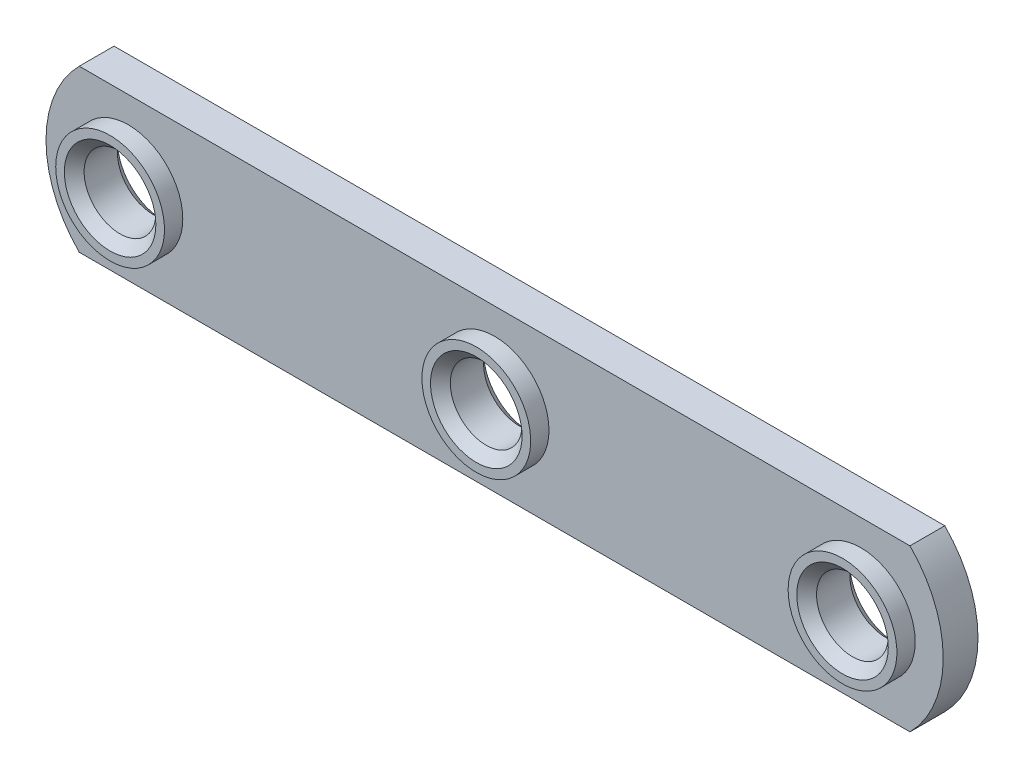
ISO-10303-21;
HEADER;
FILE_DESCRIPTION(('STEP AP214'),'2;1');
FILE_NAME('part.step','',(''),(''),'','','');
FILE_SCHEMA(('AUTOMOTIVE_DESIGN { 1 0 10303 214 1 1 1 1 }'));
ENDSEC;
DATA;
#1=APPLICATION_CONTEXT('core data for automotive mechanical design processes');
#2=APPLICATION_PROTOCOL_DEFINITION('international standard','automotive_design',2000,#1);
#3=PRODUCT_CONTEXT('',#1,'mechanical');
#4=PRODUCT('Part','Part','',(#3));
#5=PRODUCT_RELATED_PRODUCT_CATEGORY('part','',(#4));
#6=PRODUCT_DEFINITION_FORMATION('','',#4);
#7=PRODUCT_DEFINITION_CONTEXT('part definition',#1,'design');
#8=PRODUCT_DEFINITION('design','',#6,#7);
#9=PRODUCT_DEFINITION_SHAPE('','',#8);
#10=(LENGTH_UNIT() NAMED_UNIT(*) SI_UNIT(.MILLI.,.METRE.));
#11=(NAMED_UNIT(*) PLANE_ANGLE_UNIT() SI_UNIT($,.RADIAN.));
#12=(NAMED_UNIT(*) SI_UNIT($,.STERADIAN.) SOLID_ANGLE_UNIT());
#13=UNCERTAINTY_MEASURE_WITH_UNIT(LENGTH_MEASURE(1.E-05),#10,'distance_accuracy_value','');
#14=(GEOMETRIC_REPRESENTATION_CONTEXT(3) GLOBAL_UNCERTAINTY_ASSIGNED_CONTEXT((#13)) GLOBAL_UNIT_ASSIGNED_CONTEXT((#10,
#11,#12)) REPRESENTATION_CONTEXT('',''));
#15=CARTESIAN_POINT('',(0.,0.,0.));
#16=DIRECTION('',(0.,0.,1.));
#17=DIRECTION('',(1.,0.,0.));
#18=AXIS2_PLACEMENT_3D('',#15,#16,#17);
#19=CARTESIAN_POINT('',(48.5901999999992,0.,-1.2065));
#20=DIRECTION('',(0.,0.,1.));
#21=DIRECTION('',(1.,0.,0.));
#22=AXIS2_PLACEMENT_3D('',#19,#20,#21);
#23=CYLINDRICAL_SURFACE('',#22,7.92480000000076);
#24=CARTESIAN_POINT('',(48.5901999999992,0.,1.2065));
#25=DIRECTION('',(0.,0.,1.));
#26=DIRECTION('',(1.,0.,0.));
#27=AXIS2_PLACEMENT_3D('',#24,#25,#26);
#28=CIRCLE('',#27,7.92480000000076);
#29=CARTESIAN_POINT('',(54.209515887188,-5.588,1.2065));
#30=VERTEX_POINT('',#29);
#31=CARTESIAN_POINT('',(54.209515887188,5.588,1.2065));
#32=VERTEX_POINT('',#31);
#33=EDGE_CURVE('E102',#30,#32,#28,.T.);
#34=ORIENTED_EDGE('',*,*,#33,.F.);
#35=DIRECTION('',(0.,0.,1.));
#36=VECTOR('',#35,1.);
#37=CARTESIAN_POINT('',(54.209515887188,-5.588,-1.2065));
#38=LINE('',#37,#36);
#39=CARTESIAN_POINT('',(54.209515887188,-5.588,-1.2065));
#40=VERTEX_POINT('',#39);
#41=EDGE_CURVE('E50',#40,#30,#38,.T.);
#42=ORIENTED_EDGE('',*,*,#41,.F.);
#43=CARTESIAN_POINT('',(48.5901999999992,0.,-1.2065));
#44=DIRECTION('',(0.,0.,1.));
#45=DIRECTION('',(1.,0.,0.));
#46=AXIS2_PLACEMENT_3D('',#43,#44,#45);
#47=CIRCLE('',#46,7.92480000000076);
#48=CARTESIAN_POINT('',(54.209515887188,5.588,-1.2065));
#49=VERTEX_POINT('',#48);
#50=EDGE_CURVE('E95',#40,#49,#47,.T.);
#51=ORIENTED_EDGE('',*,*,#50,.T.);
#52=DIRECTION('',(0.,0.,1.));
#53=VECTOR('',#52,1.);
#54=CARTESIAN_POINT('',(54.209515887188,5.588,-1.2065));
#55=LINE('',#54,#53);
#56=EDGE_CURVE('E78',#49,#32,#55,.T.);
#57=ORIENTED_EDGE('',*,*,#56,.T.);
#58=EDGE_LOOP('',(#34,#42,#51,#57));
#59=FACE_BOUND('',#58,.T.);
#60=ADVANCED_FACE('F33',(#59),#23,.T.);
#61=CARTESIAN_POINT('',(-3.40951588718771,-5.588,-1.2065));
#62=DIRECTION('',(0.,-1.,0.));
#63=DIRECTION('',(1.,0.,0.));
#64=AXIS2_PLACEMENT_3D('',#61,#62,#63);
#65=PLANE('',#64);
#66=DIRECTION('',(1.,0.,0.));
#67=VECTOR('',#66,1.);
#68=CARTESIAN_POINT('',(-3.40951588718771,-5.588,1.2065));
#69=LINE('',#68,#67);
#70=CARTESIAN_POINT('',(-3.40951588718771,-5.588,1.2065));
#71=VERTEX_POINT('',#70);
#72=EDGE_CURVE('E97',#71,#30,#69,.T.);
#73=ORIENTED_EDGE('',*,*,#72,.F.);
#74=DIRECTION('',(0.,0.,1.));
#75=VECTOR('',#74,1.);
#76=CARTESIAN_POINT('',(-3.40951588718771,-5.588,-1.2065));
#77=LINE('',#76,#75);
#78=CARTESIAN_POINT('',(-3.40951588718771,-5.588,-1.2065));
#79=VERTEX_POINT('',#78);
#80=EDGE_CURVE('E67',#79,#71,#77,.T.);
#81=ORIENTED_EDGE('',*,*,#80,.F.);
#82=DIRECTION('',(1.,0.,0.));
#83=VECTOR('',#82,1.);
#84=CARTESIAN_POINT('',(-3.40951588718771,-5.588,-1.2065));
#85=LINE('',#84,#83);
#86=EDGE_CURVE('E92',#79,#40,#85,.T.);
#87=ORIENTED_EDGE('',*,*,#86,.T.);
#88=ORIENTED_EDGE('',*,*,#41,.T.);
#89=EDGE_LOOP('',(#73,#81,#87,#88));
#90=FACE_BOUND('',#89,.T.);
#91=ADVANCED_FACE('F159',(#90),#65,.T.);
#92=CARTESIAN_POINT('',(2.20980000000002,0.,-1.2065));
#93=DIRECTION('',(0.,0.,1.));
#94=DIRECTION('',(1.,0.,0.));
#95=AXIS2_PLACEMENT_3D('',#92,#93,#94);
#96=CYLINDRICAL_SURFACE('',#95,7.92480000000003);
#97=CARTESIAN_POINT('',(2.20980000000002,0.,1.2065));
#98=DIRECTION('',(0.,0.,1.));
#99=DIRECTION('',(1.,0.,0.));
#100=AXIS2_PLACEMENT_3D('',#97,#98,#99);
#101=CIRCLE('',#100,7.92480000000003);
#102=CARTESIAN_POINT('',(-3.40951588718771,5.588,1.2065));
#103=VERTEX_POINT('',#102);
#104=EDGE_CURVE('E86',#103,#71,#101,.T.);
#105=ORIENTED_EDGE('',*,*,#104,.F.);
#106=DIRECTION('',(0.,0.,1.));
#107=VECTOR('',#106,1.);
#108=CARTESIAN_POINT('',(-3.40951588718771,5.588,-1.2065));
#109=LINE('',#108,#107);
#110=CARTESIAN_POINT('',(-3.40951588718771,5.588,-1.2065));
#111=VERTEX_POINT('',#110);
#112=EDGE_CURVE('E81',#111,#103,#109,.T.);
#113=ORIENTED_EDGE('',*,*,#112,.F.);
#114=CARTESIAN_POINT('',(2.20980000000002,0.,-1.2065));
#115=DIRECTION('',(0.,0.,1.));
#116=DIRECTION('',(1.,0.,0.));
#117=AXIS2_PLACEMENT_3D('',#114,#115,#116);
#118=CIRCLE('',#117,7.92480000000003);
#119=EDGE_CURVE('E84',#111,#79,#118,.T.);
#120=ORIENTED_EDGE('',*,*,#119,.T.);
#121=ORIENTED_EDGE('',*,*,#80,.T.);
#122=EDGE_LOOP('',(#105,#113,#120,#121));
#123=FACE_BOUND('',#122,.T.);
#124=ADVANCED_FACE('F83',(#123),#96,.T.);
#125=CARTESIAN_POINT('',(54.209515887188,5.588,-1.2065));
#126=DIRECTION('',(0.,1.,0.));
#127=DIRECTION('',(0.,0.,1.));
#128=AXIS2_PLACEMENT_3D('',#125,#126,#127);
#129=PLANE('',#128);
#130=DIRECTION('',(-1.,0.,0.));
#131=VECTOR('',#130,1.);
#132=CARTESIAN_POINT('',(54.209515887188,5.588,1.2065));
#133=LINE('',#132,#131);
#134=EDGE_CURVE('E105',#32,#103,#133,.T.);
#135=ORIENTED_EDGE('',*,*,#134,.F.);
#136=ORIENTED_EDGE('',*,*,#56,.F.);
#137=DIRECTION('',(-1.,0.,0.));
#138=VECTOR('',#137,1.);
#139=CARTESIAN_POINT('',(54.209515887188,5.588,-1.2065));
#140=LINE('',#139,#138);
#141=EDGE_CURVE('E91',#49,#111,#140,.T.);
#142=ORIENTED_EDGE('',*,*,#141,.T.);
#143=ORIENTED_EDGE('',*,*,#112,.T.);
#144=EDGE_LOOP('',(#135,#136,#142,#143));
#145=FACE_BOUND('',#144,.T.);
#146=ADVANCED_FACE('F94',(#145),#129,.T.);
#147=CARTESIAN_POINT('',(48.5901999999992,0.,-1.2065));
#148=DIRECTION('',(0.,0.,1.));
#149=DIRECTION('',(1.,0.,0.));
#150=AXIS2_PLACEMENT_3D('',#147,#148,#149);
#151=PLANE('',#150);
#152=CARTESIAN_POINT('',(0.,0.,-1.2065));
#153=DIRECTION('',(0.,0.,1.));
#154=DIRECTION('',(1.,0.,0.));
#155=AXIS2_PLACEMENT_3D('',#152,#153,#154);
#156=CIRCLE('',#155,3.17499999999998);
#157=CARTESIAN_POINT('',(3.17499999999998,0.,-1.2065));
#158=VERTEX_POINT('',#157);
#159=EDGE_CURVE('E129',#158,#158,#156,.T.);
#160=ORIENTED_EDGE('',*,*,#159,.T.);
#161=EDGE_LOOP('',(#160));
#162=FACE_BOUND('',#161,.T.);
#163=CARTESIAN_POINT('',(50.8,0.,-1.2065));
#164=DIRECTION('',(0.,0.,1.));
#165=DIRECTION('',(1.,0.,0.));
#166=AXIS2_PLACEMENT_3D('',#163,#164,#165);
#167=CIRCLE('',#166,3.17499999999999);
#168=CARTESIAN_POINT('',(53.975,0.,-1.2065));
#169=VERTEX_POINT('',#168);
#170=EDGE_CURVE('E126',#169,#169,#167,.T.);
#171=ORIENTED_EDGE('',*,*,#170,.T.);
#172=EDGE_LOOP('',(#171));
#173=FACE_BOUND('',#172,.T.);
#174=CARTESIAN_POINT('',(25.4,0.,-1.2065));
#175=DIRECTION('',(0.,0.,1.));
#176=DIRECTION('',(1.,0.,0.));
#177=AXIS2_PLACEMENT_3D('',#174,#175,#176);
#178=CIRCLE('',#177,3.175);
#179=CARTESIAN_POINT('',(28.575,0.,-1.2065));
#180=VERTEX_POINT('',#179);
#181=EDGE_CURVE('E123',#180,#180,#178,.T.);
#182=ORIENTED_EDGE('',*,*,#181,.T.);
#183=EDGE_LOOP('',(#182));
#184=FACE_BOUND('',#183,.T.);
#185=ORIENTED_EDGE('',*,*,#50,.F.);
#186=ORIENTED_EDGE('',*,*,#86,.F.);
#187=ORIENTED_EDGE('',*,*,#119,.F.);
#188=ORIENTED_EDGE('',*,*,#141,.F.);
#189=EDGE_LOOP('',(#185,#186,#187,#188));
#190=FACE_BOUND('',#189,.T.);
#191=ADVANCED_FACE('F90',(#162,#173,#184,#190),#151,.F.);
#192=CARTESIAN_POINT('',(48.5901999999992,0.,1.2065));
#193=DIRECTION('',(0.,0.,1.));
#194=DIRECTION('',(1.,0.,0.));
#195=AXIS2_PLACEMENT_3D('',#192,#193,#194);
#196=PLANE('',#195);
#197=CARTESIAN_POINT('',(50.8,0.,1.2065));
#198=DIRECTION('',(0.,0.,1.));
#199=DIRECTION('',(1.,0.,0.));
#200=AXIS2_PLACEMENT_3D('',#197,#198,#199);
#201=CIRCLE('',#200,3.7719);
#202=CARTESIAN_POINT('',(54.5719,0.,1.2065));
#203=VERTEX_POINT('',#202);
#204=EDGE_CURVE('E120',#203,#203,#201,.T.);
#205=ORIENTED_EDGE('',*,*,#204,.F.);
#206=EDGE_LOOP('',(#205));
#207=FACE_BOUND('',#206,.T.);
#208=CARTESIAN_POINT('',(0.,0.,1.2065));
#209=DIRECTION('',(0.,0.,1.));
#210=DIRECTION('',(1.,0.,0.));
#211=AXIS2_PLACEMENT_3D('',#208,#209,#210);
#212=CIRCLE('',#211,3.7719);
#213=CARTESIAN_POINT('',(3.7719,0.,1.2065));
#214=VERTEX_POINT('',#213);
#215=EDGE_CURVE('E117',#214,#214,#212,.T.);
#216=ORIENTED_EDGE('',*,*,#215,.F.);
#217=EDGE_LOOP('',(#216));
#218=FACE_BOUND('',#217,.T.);
#219=CARTESIAN_POINT('',(25.4,0.,1.2065));
#220=DIRECTION('',(0.,0.,1.));
#221=DIRECTION('',(1.,0.,0.));
#222=AXIS2_PLACEMENT_3D('',#219,#220,#221);
#223=CIRCLE('',#222,3.7719);
#224=CARTESIAN_POINT('',(29.1719,0.,1.2065));
#225=VERTEX_POINT('',#224);
#226=EDGE_CURVE('E112',#225,#225,#223,.T.);
#227=ORIENTED_EDGE('',*,*,#226,.F.);
#228=EDGE_LOOP('',(#227));
#229=FACE_BOUND('',#228,.T.);
#230=ORIENTED_EDGE('',*,*,#33,.T.);
#231=ORIENTED_EDGE('',*,*,#134,.T.);
#232=ORIENTED_EDGE('',*,*,#104,.T.);
#233=ORIENTED_EDGE('',*,*,#72,.T.);
#234=EDGE_LOOP('',(#230,#231,#232,#233));
#235=FACE_BOUND('',#234,.T.);
#236=ADVANCED_FACE('F148',(#207,#218,#229,#235),#196,.T.);
#237=CARTESIAN_POINT('',(25.4,0.,2.4765));
#238=DIRECTION('',(0.,0.,-1.));
#239=DIRECTION('',(-1.,0.,0.));
#240=AXIS2_PLACEMENT_3D('',#237,#238,#239);
#241=CYLINDRICAL_SURFACE('',#240,3.7719);
#242=CARTESIAN_POINT('',(25.4,0.,2.4765));
#243=DIRECTION('',(0.,0.,-1.));
#244=DIRECTION('',(-1.,0.,0.));
#245=AXIS2_PLACEMENT_3D('',#242,#243,#244);
#246=CIRCLE('',#245,3.7719);
#247=CARTESIAN_POINT('',(21.6281,0.,2.4765));
#248=VERTEX_POINT('',#247);
#249=EDGE_CURVE('E106',#248,#248,#246,.T.);
#250=ORIENTED_EDGE('',*,*,#249,.T.);
#251=EDGE_LOOP('',(#250));
#252=FACE_BOUND('',#251,.T.);
#253=ORIENTED_EDGE('',*,*,#226,.T.);
#254=EDGE_LOOP('',(#253));
#255=FACE_BOUND('',#254,.T.);
#256=ADVANCED_FACE('F213',(#252,#255),#241,.T.);
#257=CARTESIAN_POINT('',(29.1719,0.,2.4765));
#258=DIRECTION('',(0.,0.,1.));
#259=DIRECTION('',(1.,0.,0.));
#260=AXIS2_PLACEMENT_3D('',#257,#258,#259);
#261=PLANE('',#260);
#262=CARTESIAN_POINT('',(25.4,0.,2.4765));
#263=DIRECTION('',(0.,0.,1.));
#264=DIRECTION('',(1.,0.,0.));
#265=AXIS2_PLACEMENT_3D('',#262,#263,#264);
#266=CIRCLE('',#265,3.175);
#267=CARTESIAN_POINT('',(28.575,0.,2.4765));
#268=VERTEX_POINT('',#267);
#269=EDGE_CURVE('E188',#268,#268,#266,.T.);
#270=ORIENTED_EDGE('',*,*,#269,.F.);
#271=EDGE_LOOP('',(#270));
#272=FACE_BOUND('',#271,.T.);
#273=ORIENTED_EDGE('',*,*,#249,.F.);
#274=EDGE_LOOP('',(#273));
#275=FACE_BOUND('',#274,.T.);
#276=ADVANCED_FACE('F216',(#272,#275),#261,.T.);
#277=CARTESIAN_POINT('',(0.,0.,2.4765));
#278=DIRECTION('',(0.,0.,-1.));
#279=DIRECTION('',(-1.,0.,0.));
#280=AXIS2_PLACEMENT_3D('',#277,#278,#279);
#281=CYLINDRICAL_SURFACE('',#280,3.7719);
#282=CARTESIAN_POINT('',(0.,0.,2.4765));
#283=DIRECTION('',(0.,0.,-1.));
#284=DIRECTION('',(-1.,0.,0.));
#285=AXIS2_PLACEMENT_3D('',#282,#283,#284);
#286=CIRCLE('',#285,3.7719);
#287=CARTESIAN_POINT('',(-3.7719,0.,2.4765));
#288=VERTEX_POINT('',#287);
#289=EDGE_CURVE('E208',#288,#288,#286,.T.);
#290=ORIENTED_EDGE('',*,*,#289,.T.);
#291=EDGE_LOOP('',(#290));
#292=FACE_BOUND('',#291,.T.);
#293=ORIENTED_EDGE('',*,*,#215,.T.);
#294=EDGE_LOOP('',(#293));
#295=FACE_BOUND('',#294,.T.);
#296=ADVANCED_FACE('F218',(#292,#295),#281,.T.);
#297=CARTESIAN_POINT('',(3.7719,0.,2.4765));
#298=DIRECTION('',(0.,0.,1.));
#299=DIRECTION('',(1.,0.,0.));
#300=AXIS2_PLACEMENT_3D('',#297,#298,#299);
#301=PLANE('',#300);
#302=CARTESIAN_POINT('',(0.,0.,2.4765));
#303=DIRECTION('',(0.,0.,1.));
#304=DIRECTION('',(1.,0.,0.));
#305=AXIS2_PLACEMENT_3D('',#302,#303,#304);
#306=CIRCLE('',#305,3.175);
#307=CARTESIAN_POINT('',(3.175,0.,2.4765));
#308=VERTEX_POINT('',#307);
#309=EDGE_CURVE('E189',#308,#308,#306,.T.);
#310=ORIENTED_EDGE('',*,*,#309,.F.);
#311=EDGE_LOOP('',(#310));
#312=FACE_BOUND('',#311,.T.);
#313=ORIENTED_EDGE('',*,*,#289,.F.);
#314=EDGE_LOOP('',(#313));
#315=FACE_BOUND('',#314,.T.);
#316=ADVANCED_FACE('F225',(#312,#315),#301,.T.);
#317=CARTESIAN_POINT('',(50.8,0.,2.4765));
#318=DIRECTION('',(0.,0.,-1.));
#319=DIRECTION('',(-1.,0.,0.));
#320=AXIS2_PLACEMENT_3D('',#317,#318,#319);
#321=CYLINDRICAL_SURFACE('',#320,3.7719);
#322=CARTESIAN_POINT('',(50.8,0.,2.4765));
#323=DIRECTION('',(0.,0.,-1.));
#324=DIRECTION('',(-1.,0.,0.));
#325=AXIS2_PLACEMENT_3D('',#322,#323,#324);
#326=CIRCLE('',#325,3.7719);
#327=CARTESIAN_POINT('',(47.0281,0.,2.4765));
#328=VERTEX_POINT('',#327);
#329=EDGE_CURVE('E205',#328,#328,#326,.T.);
#330=ORIENTED_EDGE('',*,*,#329,.T.);
#331=EDGE_LOOP('',(#330));
#332=FACE_BOUND('',#331,.T.);
#333=ORIENTED_EDGE('',*,*,#204,.T.);
#334=EDGE_LOOP('',(#333));
#335=FACE_BOUND('',#334,.T.);
#336=ADVANCED_FACE('F271',(#332,#335),#321,.T.);
#337=CARTESIAN_POINT('',(54.5719,0.,2.4765));
#338=DIRECTION('',(0.,0.,1.));
#339=DIRECTION('',(1.,0.,0.));
#340=AXIS2_PLACEMENT_3D('',#337,#338,#339);
#341=PLANE('',#340);
#342=CARTESIAN_POINT('',(50.8,0.,2.4765));
#343=DIRECTION('',(0.,0.,1.));
#344=DIRECTION('',(1.,0.,0.));
#345=AXIS2_PLACEMENT_3D('',#342,#343,#344);
#346=CIRCLE('',#345,3.175);
#347=CARTESIAN_POINT('',(53.975,0.,2.4765));
#348=VERTEX_POINT('',#347);
#349=EDGE_CURVE('E199',#348,#348,#346,.T.);
#350=ORIENTED_EDGE('',*,*,#349,.F.);
#351=EDGE_LOOP('',(#350));
#352=FACE_BOUND('',#351,.T.);
#353=ORIENTED_EDGE('',*,*,#329,.F.);
#354=EDGE_LOOP('',(#353));
#355=FACE_BOUND('',#354,.T.);
#356=ADVANCED_FACE('F277',(#352,#355),#341,.T.);
#357=CARTESIAN_POINT('',(50.8,0.,2.4765));
#358=DIRECTION('',(0.,0.,1.));
#359=DIRECTION('',(1.,0.,0.));
#360=AXIS2_PLACEMENT_3D('',#357,#358,#359);
#361=CYLINDRICAL_SURFACE('',#360,2.48793000000001);
#362=CARTESIAN_POINT('',(50.8,0.,-0.519430000000017));
#363=DIRECTION('',(0.,0.,1.));
#364=DIRECTION('',(1.,0.,0.));
#365=AXIS2_PLACEMENT_3D('',#362,#363,#364);
#366=CIRCLE('',#365,2.48793000000001);
#367=CARTESIAN_POINT('',(53.28793,0.,-0.519430000000017));
#368=VERTEX_POINT('',#367);
#369=EDGE_CURVE('E42',#368,#368,#366,.F.);
#370=ORIENTED_EDGE('',*,*,#369,.T.);
#371=EDGE_LOOP('',(#370));
#372=FACE_BOUND('',#371,.T.);
#373=CARTESIAN_POINT('',(50.8,0.,1.78943000000003));
#374=DIRECTION('',(0.,0.,1.));
#375=DIRECTION('',(1.,0.,0.));
#376=AXIS2_PLACEMENT_3D('',#373,#374,#375);
#377=CIRCLE('',#376,2.48793000000001);
#378=CARTESIAN_POINT('',(53.28793,0.,1.78943000000003));
#379=VERTEX_POINT('',#378);
#380=EDGE_CURVE('E202',#379,#379,#377,.T.);
#381=ORIENTED_EDGE('',*,*,#380,.T.);
#382=EDGE_LOOP('',(#381));
#383=FACE_BOUND('',#382,.T.);
#384=ADVANCED_FACE('F137',(#372,#383),#361,.F.);
#385=CARTESIAN_POINT('',(50.8,0.,2.4765));
#386=DIRECTION('',(0.,0.,1.));
#387=DIRECTION('',(1.,0.,0.));
#388=AXIS2_PLACEMENT_3D('',#385,#386,#387);
#389=CONICAL_SURFACE('',#388,3.175,0.785398163397457);
#390=ORIENTED_EDGE('',*,*,#380,.F.);
#391=EDGE_LOOP('',(#390));
#392=FACE_BOUND('',#391,.T.);
#393=ORIENTED_EDGE('',*,*,#349,.T.);
#394=EDGE_LOOP('',(#393));
#395=FACE_BOUND('',#394,.T.);
#396=ADVANCED_FACE('F291',(#392,#395),#389,.F.);
#397=CARTESIAN_POINT('',(25.4,0.,2.4765));
#398=DIRECTION('',(0.,0.,1.));
#399=DIRECTION('',(1.,0.,0.));
#400=AXIS2_PLACEMENT_3D('',#397,#398,#399);
#401=CYLINDRICAL_SURFACE('',#400,2.48793000000001);
#402=CARTESIAN_POINT('',(25.4,0.,-0.51943));
#403=DIRECTION('',(0.,0.,1.));
#404=DIRECTION('',(1.,0.,0.));
#405=AXIS2_PLACEMENT_3D('',#402,#403,#404);
#406=CIRCLE('',#405,2.48793000000001);
#407=CARTESIAN_POINT('',(27.88793,0.,-0.51943));
#408=VERTEX_POINT('',#407);
#409=EDGE_CURVE('E11',#408,#408,#406,.F.);
#410=ORIENTED_EDGE('',*,*,#409,.T.);
#411=EDGE_LOOP('',(#410));
#412=FACE_BOUND('',#411,.T.);
#413=CARTESIAN_POINT('',(25.4,0.,1.78943000000003));
#414=DIRECTION('',(0.,0.,1.));
#415=DIRECTION('',(1.,0.,0.));
#416=AXIS2_PLACEMENT_3D('',#413,#414,#415);
#417=CIRCLE('',#416,2.48793000000001);
#418=CARTESIAN_POINT('',(27.88793,0.,1.78943000000003));
#419=VERTEX_POINT('',#418);
#420=EDGE_CURVE('E192',#419,#419,#417,.T.);
#421=ORIENTED_EDGE('',*,*,#420,.T.);
#422=EDGE_LOOP('',(#421));
#423=FACE_BOUND('',#422,.T.);
#424=ADVANCED_FACE('F298',(#412,#423),#401,.F.);
#425=CARTESIAN_POINT('',(25.4,0.,2.4765));
#426=DIRECTION('',(0.,0.,1.));
#427=DIRECTION('',(1.,0.,0.));
#428=AXIS2_PLACEMENT_3D('',#425,#426,#427);
#429=CONICAL_SURFACE('',#428,3.175,0.78539816339746);
#430=ORIENTED_EDGE('',*,*,#420,.F.);
#431=EDGE_LOOP('',(#430));
#432=FACE_BOUND('',#431,.T.);
#433=ORIENTED_EDGE('',*,*,#269,.T.);
#434=EDGE_LOOP('',(#433));
#435=FACE_BOUND('',#434,.T.);
#436=ADVANCED_FACE('F183',(#432,#435),#429,.F.);
#437=CARTESIAN_POINT('',(0.,0.,2.4765));
#438=DIRECTION('',(0.,0.,1.));
#439=DIRECTION('',(1.,0.,0.));
#440=AXIS2_PLACEMENT_3D('',#437,#438,#439);
#441=CYLINDRICAL_SURFACE('',#440,2.48793000000001);
#442=CARTESIAN_POINT('',(0.,0.,-0.51943000000002));
#443=DIRECTION('',(0.,0.,1.));
#444=DIRECTION('',(1.,0.,0.));
#445=AXIS2_PLACEMENT_3D('',#442,#443,#444);
#446=CIRCLE('',#445,2.48793000000001);
#447=CARTESIAN_POINT('',(2.48793000000001,0.,-0.51943000000002));
#448=VERTEX_POINT('',#447);
#449=EDGE_CURVE('E132',#448,#448,#446,.F.);
#450=ORIENTED_EDGE('',*,*,#449,.T.);
#451=EDGE_LOOP('',(#450));
#452=FACE_BOUND('',#451,.T.);
#453=CARTESIAN_POINT('',(0.,0.,1.78943000000003));
#454=DIRECTION('',(0.,0.,1.));
#455=DIRECTION('',(1.,0.,0.));
#456=AXIS2_PLACEMENT_3D('',#453,#454,#455);
#457=CIRCLE('',#456,2.48793000000001);
#458=CARTESIAN_POINT('',(2.48793000000001,0.,1.78943000000003));
#459=VERTEX_POINT('',#458);
#460=EDGE_CURVE('E187',#459,#459,#457,.T.);
#461=ORIENTED_EDGE('',*,*,#460,.T.);
#462=EDGE_LOOP('',(#461));
#463=FACE_BOUND('',#462,.T.);
#464=ADVANCED_FACE('F174',(#452,#463),#441,.F.);
#465=CARTESIAN_POINT('',(0.,0.,2.4765));
#466=DIRECTION('',(0.,0.,1.));
#467=DIRECTION('',(1.,0.,0.));
#468=AXIS2_PLACEMENT_3D('',#465,#466,#467);
#469=CONICAL_SURFACE('',#468,3.175,0.785398163397461);
#470=ORIENTED_EDGE('',*,*,#460,.F.);
#471=EDGE_LOOP('',(#470));
#472=FACE_BOUND('',#471,.T.);
#473=ORIENTED_EDGE('',*,*,#309,.T.);
#474=EDGE_LOOP('',(#473));
#475=FACE_BOUND('',#474,.T.);
#476=ADVANCED_FACE('F169',(#472,#475),#469,.F.);
#477=CARTESIAN_POINT('',(0.,0.,-1.2065));
#478=DIRECTION('',(0.,0.,-1.));
#479=DIRECTION('',(-1.,0.,0.));
#480=AXIS2_PLACEMENT_3D('',#477,#478,#479);
#481=CONICAL_SURFACE('',#480,3.17499999999998,0.785398163397447);
#482=ORIENTED_EDGE('',*,*,#449,.F.);
#483=EDGE_LOOP('',(#482));
#484=FACE_BOUND('',#483,.T.);
#485=ORIENTED_EDGE('',*,*,#159,.F.);
#486=EDGE_LOOP('',(#485));
#487=FACE_BOUND('',#486,.T.);
#488=ADVANCED_FACE('F143',(#484,#487),#481,.F.);
#489=CARTESIAN_POINT('',(50.8,0.,-1.2065));
#490=DIRECTION('',(0.,0.,-1.));
#491=DIRECTION('',(-1.,0.,0.));
#492=AXIS2_PLACEMENT_3D('',#489,#490,#491);
#493=CONICAL_SURFACE('',#492,3.17499999999999,0.785398163397449);
#494=ORIENTED_EDGE('',*,*,#369,.F.);
#495=EDGE_LOOP('',(#494));
#496=FACE_BOUND('',#495,.T.);
#497=ORIENTED_EDGE('',*,*,#170,.F.);
#498=EDGE_LOOP('',(#497));
#499=FACE_BOUND('',#498,.T.);
#500=ADVANCED_FACE('F140',(#496,#499),#493,.F.);
#501=CARTESIAN_POINT('',(25.4,0.,-1.2065));
#502=DIRECTION('',(0.,0.,-1.));
#503=DIRECTION('',(-1.,0.,0.));
#504=AXIS2_PLACEMENT_3D('',#501,#502,#503);
#505=CONICAL_SURFACE('',#504,3.175,0.785398163397442);
#506=ORIENTED_EDGE('',*,*,#409,.F.);
#507=EDGE_LOOP('',(#506));
#508=FACE_BOUND('',#507,.T.);
#509=ORIENTED_EDGE('',*,*,#181,.F.);
#510=EDGE_LOOP('',(#509));
#511=FACE_BOUND('',#510,.T.);
#512=ADVANCED_FACE('F35',(#508,#511),#505,.F.);
#513=CLOSED_SHELL('',(#60,#91,#124,#146,#191,#236,#256,#276,#296,#316,#336,#356,#384,#396,#424,
#436,#464,#476,#488,#500,#512));
#514=MANIFOLD_SOLID_BREP('B2',#513);
#515=ADVANCED_BREP_SHAPE_REPRESENTATION('',(#18,#514),#14);
#516=SHAPE_DEFINITION_REPRESENTATION(#9,#515);
ENDSEC;
END-ISO-10303-21;
